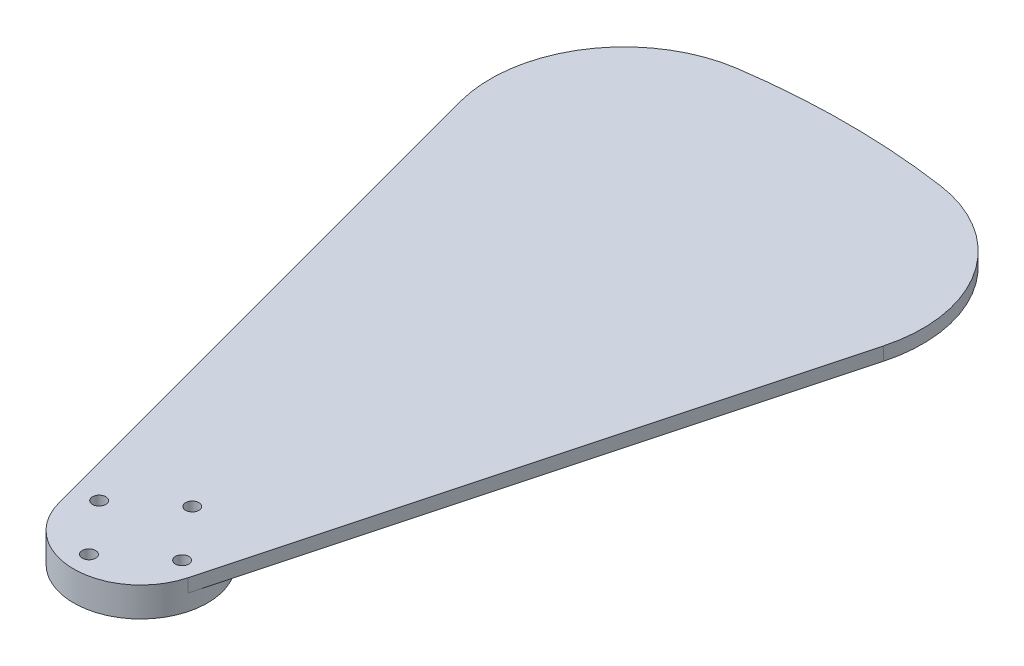
ISO-10303-21;
HEADER;
FILE_DESCRIPTION(('STEP AP214'),'2;1');
FILE_NAME('part.step','',(''),(''),'','','');
FILE_SCHEMA(('AUTOMOTIVE_DESIGN { 1 0 10303 214 1 1 1 1 }'));
ENDSEC;
DATA;
#1=APPLICATION_CONTEXT('core data for automotive mechanical design processes');
#2=APPLICATION_PROTOCOL_DEFINITION('international standard','automotive_design',2000,#1);
#3=PRODUCT_CONTEXT('',#1,'mechanical');
#4=PRODUCT('Part','Part','',(#3));
#5=PRODUCT_RELATED_PRODUCT_CATEGORY('part','',(#4));
#6=PRODUCT_DEFINITION_FORMATION('','',#4);
#7=PRODUCT_DEFINITION_CONTEXT('part definition',#1,'design');
#8=PRODUCT_DEFINITION('design','',#6,#7);
#9=PRODUCT_DEFINITION_SHAPE('','',#8);
#10=(LENGTH_UNIT() NAMED_UNIT(*) SI_UNIT(.MILLI.,.METRE.));
#11=(NAMED_UNIT(*) PLANE_ANGLE_UNIT() SI_UNIT($,.RADIAN.));
#12=(NAMED_UNIT(*) SI_UNIT($,.STERADIAN.) SOLID_ANGLE_UNIT());
#13=UNCERTAINTY_MEASURE_WITH_UNIT(LENGTH_MEASURE(1.E-05),#10,'distance_accuracy_value','');
#14=(GEOMETRIC_REPRESENTATION_CONTEXT(3) GLOBAL_UNCERTAINTY_ASSIGNED_CONTEXT((#13)) GLOBAL_UNIT_ASSIGNED_CONTEXT((#10,
#11,#12)) REPRESENTATION_CONTEXT('',''));
#15=CARTESIAN_POINT('',(0.,0.,0.));
#16=DIRECTION('',(0.,0.,1.));
#17=DIRECTION('',(1.,0.,0.));
#18=AXIS2_PLACEMENT_3D('',#15,#16,#17);
#19=CARTESIAN_POINT('',(0.,4.4,0.));
#20=DIRECTION('',(0.,-1.,0.));
#21=DIRECTION('',(0.,0.,-1.));
#22=AXIS2_PLACEMENT_3D('',#19,#20,#21);
#23=CYLINDRICAL_SURFACE('',#22,105.475115548645);
#24=CARTESIAN_POINT('',(0.,4.4,0.));
#25=DIRECTION('',(0.,-1.,0.));
#26=DIRECTION('',(0.,0.,-1.));
#27=AXIS2_PLACEMENT_3D('',#24,#25,#26);
#28=CIRCLE('',#27,105.475115548645);
#29=CARTESIAN_POINT('',(-15.1921075024969,4.4,-104.375283806237));
#30=VERTEX_POINT('',#29);
#31=CARTESIAN_POINT('',(15.1921075024969,4.4,-104.375283806237));
#32=VERTEX_POINT('',#31);
#33=EDGE_CURVE('E129',#30,#32,#28,.T.);
#34=ORIENTED_EDGE('',*,*,#33,.T.);
#35=DIRECTION('',(0.,-1.,0.));
#36=VECTOR('',#35,1.);
#37=CARTESIAN_POINT('',(15.1921075024969,4.4,-104.375283806237));
#38=LINE('',#37,#36);
#39=CARTESIAN_POINT('',(15.1921075024969,2.4,-104.375283806237));
#40=VERTEX_POINT('',#39);
#41=EDGE_CURVE('E122',#32,#40,#38,.T.);
#42=ORIENTED_EDGE('',*,*,#41,.T.);
#43=CARTESIAN_POINT('',(0.,2.4,0.));
#44=DIRECTION('',(0.,-1.,0.));
#45=DIRECTION('',(0.,0.,-1.));
#46=AXIS2_PLACEMENT_3D('',#43,#44,#45);
#47=CIRCLE('',#46,105.475115548645);
#48=CARTESIAN_POINT('',(-15.1921075024969,2.4,-104.375283806237));
#49=VERTEX_POINT('',#48);
#50=EDGE_CURVE('E105',#49,#40,#47,.T.);
#51=ORIENTED_EDGE('',*,*,#50,.F.);
#52=DIRECTION('',(0.,-1.,0.));
#53=VECTOR('',#52,1.);
#54=CARTESIAN_POINT('',(-15.1921075024969,4.4,-104.375283806237));
#55=LINE('',#54,#53);
#56=EDGE_CURVE('E120',#49,#30,#55,.F.);
#57=ORIENTED_EDGE('',*,*,#56,.T.);
#58=EDGE_LOOP('',(#34,#42,#51,#57));
#59=FACE_BOUND('',#58,.T.);
#60=ADVANCED_FACE('F41',(#59),#23,.T.);
#61=CARTESIAN_POINT('',(-9.65925826289068,4.4,2.58819045102521));
#62=DIRECTION('',(-0.965925826289068,0.,0.258819045102522));
#63=DIRECTION('',(0.258819045102522,0.,0.965925826289068));
#64=AXIS2_PLACEMENT_3D('',#61,#62,#63);
#65=PLANE('',#64);
#66=DIRECTION('',(-0.258819045102522,0.,-0.965925826289068));
#67=VECTOR('',#66,1.);
#68=CARTESIAN_POINT('',(-9.65925826289068,4.4,2.58819045102521));
#69=LINE('',#68,#67);
#70=CARTESIAN_POINT('',(-9.65925826289068,4.4,2.58819045102521));
#71=VERTEX_POINT('',#70);
#72=CARTESIAN_POINT('',(-31.6299241734408,4.4,-79.4074510032692));
#73=VERTEX_POINT('',#72);
#74=EDGE_CURVE('E115',#71,#73,#69,.T.);
#75=ORIENTED_EDGE('',*,*,#74,.T.);
#76=DIRECTION('',(0.,-1.,0.));
#77=VECTOR('',#76,1.);
#78=CARTESIAN_POINT('',(-31.6299241734408,4.4,-79.4074510032692));
#79=LINE('',#78,#77);
#80=CARTESIAN_POINT('',(-31.6299241734408,2.4,-79.4074510032692));
#81=VERTEX_POINT('',#80);
#82=EDGE_CURVE('E11',#73,#81,#79,.T.);
#83=ORIENTED_EDGE('',*,*,#82,.T.);
#84=DIRECTION('',(-0.258819045102522,0.,-0.965925826289068));
#85=VECTOR('',#84,1.);
#86=CARTESIAN_POINT('',(-9.65925826289068,2.4,2.58819045102521));
#87=LINE('',#86,#85);
#88=CARTESIAN_POINT('',(-9.65925826289068,2.4,2.58819045102521));
#89=VERTEX_POINT('',#88);
#90=EDGE_CURVE('E104',#89,#81,#87,.T.);
#91=ORIENTED_EDGE('',*,*,#90,.F.);
#92=DIRECTION('',(0.,-1.,0.));
#93=VECTOR('',#92,1.);
#94=CARTESIAN_POINT('',(-9.65925826289068,4.4,2.58819045102521));
#95=LINE('',#94,#93);
#96=EDGE_CURVE('E114',#71,#89,#95,.T.);
#97=ORIENTED_EDGE('',*,*,#96,.F.);
#98=EDGE_LOOP('',(#75,#83,#91,#97));
#99=FACE_BOUND('',#98,.T.);
#100=ADVANCED_FACE('F165',(#99),#65,.T.);
#101=CARTESIAN_POINT('',(0.,4.4,0.));
#102=DIRECTION('',(0.,-1.,0.));
#103=DIRECTION('',(0.,0.,-1.));
#104=AXIS2_PLACEMENT_3D('',#101,#102,#103);
#105=CYLINDRICAL_SURFACE('',#104,10.);
#106=ORIENTED_EDGE('',*,*,#96,.T.);
#107=CARTESIAN_POINT('',(0.,2.4,0.));
#108=DIRECTION('',(0.,-1.,0.));
#109=DIRECTION('',(0.,0.,-1.));
#110=AXIS2_PLACEMENT_3D('',#107,#108,#109);
#111=CIRCLE('',#110,10.);
#112=CARTESIAN_POINT('',(9.65925826289068,2.4,2.58819045102522));
#113=VERTEX_POINT('',#112);
#114=EDGE_CURVE('E101',#89,#113,#111,.T.);
#115=ORIENTED_EDGE('',*,*,#114,.T.);
#116=DIRECTION('',(0.,-1.,0.));
#117=VECTOR('',#116,1.);
#118=CARTESIAN_POINT('',(9.65925826289068,4.4,2.58819045102521));
#119=LINE('',#118,#117);
#120=CARTESIAN_POINT('',(9.65925826289068,4.4,2.58819045102521));
#121=VERTEX_POINT('',#120);
#122=EDGE_CURVE('E108',#121,#113,#119,.T.);
#123=ORIENTED_EDGE('',*,*,#122,.F.);
#124=CARTESIAN_POINT('',(0.,4.4,0.));
#125=DIRECTION('',(0.,-1.,0.));
#126=DIRECTION('',(0.,0.,-1.));
#127=AXIS2_PLACEMENT_3D('',#124,#125,#126);
#128=CIRCLE('',#127,10.);
#129=EDGE_CURVE('E133',#121,#71,#128,.T.);
#130=ORIENTED_EDGE('',*,*,#129,.T.);
#131=EDGE_LOOP('',(#106,#115,#123,#130));
#132=FACE_BOUND('',#131,.T.);
#133=CARTESIAN_POINT('',(0.,0.,0.));
#134=DIRECTION('',(0.,-1.,0.));
#135=DIRECTION('',(0.,0.,-1.));
#136=AXIS2_PLACEMENT_3D('',#133,#134,#135);
#137=CIRCLE('',#136,10.);
#138=CARTESIAN_POINT('',(0.,0.,-10.));
#139=VERTEX_POINT('',#138);
#140=EDGE_CURVE('E127',#139,#139,#137,.T.);
#141=ORIENTED_EDGE('',*,*,#140,.F.);
#142=EDGE_LOOP('',(#141));
#143=FACE_BOUND('',#142,.T.);
#144=ADVANCED_FACE('F117',(#132,#143),#105,.T.);
#145=CARTESIAN_POINT('',(36.8352579986555,4.4,-98.834021309327));
#146=DIRECTION('',(0.965925826289068,0.,0.258819045102522));
#147=DIRECTION('',(0.258819045102522,0.,-0.965925826289068));
#148=AXIS2_PLACEMENT_3D('',#145,#146,#147);
#149=PLANE('',#148);
#150=DIRECTION('',(-0.258819045102522,0.,0.965925826289068));
#151=VECTOR('',#150,1.);
#152=CARTESIAN_POINT('',(36.8352579986555,2.4,-98.834021309327));
#153=LINE('',#152,#151);
#154=CARTESIAN_POINT('',(31.6299241734408,2.4,-79.4074510032692));
#155=VERTEX_POINT('',#154);
#156=EDGE_CURVE('E95',#155,#113,#153,.T.);
#157=ORIENTED_EDGE('',*,*,#156,.F.);
#158=DIRECTION('',(0.,-1.,0.));
#159=VECTOR('',#158,1.);
#160=CARTESIAN_POINT('',(31.6299241734408,4.4,-79.4074510032692));
#161=LINE('',#160,#159);
#162=CARTESIAN_POINT('',(31.6299241734408,4.4,-79.4074510032692));
#163=VERTEX_POINT('',#162);
#164=EDGE_CURVE('E64',#155,#163,#161,.F.);
#165=ORIENTED_EDGE('',*,*,#164,.T.);
#166=DIRECTION('',(-0.258819045102522,0.,0.965925826289068));
#167=VECTOR('',#166,1.);
#168=CARTESIAN_POINT('',(36.8352579986555,4.4,-98.834021309327));
#169=LINE('',#168,#167);
#170=EDGE_CURVE('E110',#163,#121,#169,.T.);
#171=ORIENTED_EDGE('',*,*,#170,.T.);
#172=ORIENTED_EDGE('',*,*,#122,.T.);
#173=EDGE_LOOP('',(#157,#165,#171,#172));
#174=FACE_BOUND('',#173,.T.);
#175=ADVANCED_FACE('F109',(#174),#149,.T.);
#176=CARTESIAN_POINT('',(0.,4.4,0.));
#177=DIRECTION('',(0.,-1.,0.));
#178=DIRECTION('',(0.,0.,-1.));
#179=AXIS2_PLACEMENT_3D('',#176,#177,#178);
#180=PLANE('',#179);
#181=CARTESIAN_POINT('',(6.95839114253551,4.4,0.762097570904965));
#182=DIRECTION('',(0.,-1.,0.));
#183=DIRECTION('',(0.,0.,-1.));
#184=AXIS2_PLACEMENT_3D('',#181,#182,#183);
#185=CIRCLE('',#184,0.999999999998296);
#186=CARTESIAN_POINT('',(6.95839114253551,4.4,-0.237902429093332));
#187=VERTEX_POINT('',#186);
#188=EDGE_CURVE('E204',#187,#187,#185,.T.);
#189=ORIENTED_EDGE('',*,*,#188,.T.);
#190=EDGE_LOOP('',(#189));
#191=FACE_BOUND('',#190,.T.);
#192=CARTESIAN_POINT('',(0.762097570911941,4.4,-6.95839114252869));
#193=DIRECTION('',(0.,-1.,0.));
#194=DIRECTION('',(0.,0.,-1.));
#195=AXIS2_PLACEMENT_3D('',#192,#193,#194);
#196=CIRCLE('',#195,0.999999999998297);
#197=CARTESIAN_POINT('',(0.762097570911941,4.4,-7.95839114252699));
#198=VERTEX_POINT('',#197);
#199=EDGE_CURVE('E199',#198,#198,#196,.T.);
#200=ORIENTED_EDGE('',*,*,#199,.T.);
#201=EDGE_LOOP('',(#200));
#202=FACE_BOUND('',#201,.T.);
#203=CARTESIAN_POINT('',(-0.762097570898134,4.4,6.95839114252854));
#204=DIRECTION('',(0.,-1.,0.));
#205=DIRECTION('',(0.,0.,-1.));
#206=AXIS2_PLACEMENT_3D('',#203,#204,#205);
#207=CIRCLE('',#206,0.999999999998297);
#208=CARTESIAN_POINT('',(-0.762097570898134,4.4,5.95839114253024));
#209=VERTEX_POINT('',#208);
#210=EDGE_CURVE('E215',#209,#209,#207,.T.);
#211=ORIENTED_EDGE('',*,*,#210,.T.);
#212=EDGE_LOOP('',(#211));
#213=FACE_BOUND('',#212,.T.);
#214=CARTESIAN_POINT('',(-6.95839114252171,4.4,-0.762097570905104));
#215=DIRECTION('',(0.,-1.,0.));
#216=DIRECTION('',(0.,0.,-1.));
#217=AXIS2_PLACEMENT_3D('',#214,#215,#216);
#218=CIRCLE('',#217,0.999999999998296);
#219=CARTESIAN_POINT('',(-6.95839114252171,4.4,-1.7620975709034));
#220=VERTEX_POINT('',#219);
#221=EDGE_CURVE('E220',#220,#220,#218,.T.);
#222=ORIENTED_EDGE('',*,*,#221,.T.);
#223=EDGE_LOOP('',(#222));
#224=FACE_BOUND('',#223,.T.);
#225=ORIENTED_EDGE('',*,*,#170,.F.);
#226=CARTESIAN_POINT('',(12.3114076476595,4.4,-84.5838319053196));
#227=DIRECTION('',(0.,-1.,0.));
#228=DIRECTION('',(0.,0.,-1.));
#229=AXIS2_PLACEMENT_3D('',#226,#227,#228);
#230=CIRCLE('',#229,20.);
#231=EDGE_CURVE('E49',#163,#32,#230,.F.);
#232=ORIENTED_EDGE('',*,*,#231,.T.);
#233=ORIENTED_EDGE('',*,*,#33,.F.);
#234=CARTESIAN_POINT('',(-12.3114076476595,4.4,-84.5838319053196));
#235=DIRECTION('',(0.,-1.,0.));
#236=DIRECTION('',(0.,0.,-1.));
#237=AXIS2_PLACEMENT_3D('',#234,#235,#236);
#238=CIRCLE('',#237,20.);
#239=EDGE_CURVE('E56',#30,#73,#238,.F.);
#240=ORIENTED_EDGE('',*,*,#239,.T.);
#241=ORIENTED_EDGE('',*,*,#74,.F.);
#242=ORIENTED_EDGE('',*,*,#129,.F.);
#243=EDGE_LOOP('',(#225,#232,#233,#240,#241,#242));
#244=FACE_BOUND('',#243,.T.);
#245=ADVANCED_FACE('F145',(#191,#202,#213,#224,#244),#180,.F.);
#246=CARTESIAN_POINT('',(0.,2.4,0.));
#247=DIRECTION('',(0.,-1.,0.));
#248=DIRECTION('',(0.,0.,-1.));
#249=AXIS2_PLACEMENT_3D('',#246,#247,#248);
#250=PLANE('',#249);
#251=ORIENTED_EDGE('',*,*,#50,.T.);
#252=CARTESIAN_POINT('',(12.3114076476595,2.4,-84.5838319053196));
#253=DIRECTION('',(0.,-1.,0.));
#254=DIRECTION('',(0.,0.,-1.));
#255=AXIS2_PLACEMENT_3D('',#252,#253,#254);
#256=CIRCLE('',#255,20.);
#257=EDGE_CURVE('E103',#40,#155,#256,.T.);
#258=ORIENTED_EDGE('',*,*,#257,.T.);
#259=ORIENTED_EDGE('',*,*,#156,.T.);
#260=ORIENTED_EDGE('',*,*,#114,.F.);
#261=ORIENTED_EDGE('',*,*,#90,.T.);
#262=CARTESIAN_POINT('',(-12.3114076476595,2.4,-84.5838319053196));
#263=DIRECTION('',(0.,-1.,0.));
#264=DIRECTION('',(0.,0.,-1.));
#265=AXIS2_PLACEMENT_3D('',#262,#263,#264);
#266=CIRCLE('',#265,20.);
#267=EDGE_CURVE('E140',#81,#49,#266,.T.);
#268=ORIENTED_EDGE('',*,*,#267,.T.);
#269=EDGE_LOOP('',(#251,#258,#259,#260,#261,#268));
#270=FACE_BOUND('',#269,.T.);
#271=ADVANCED_FACE('F98',(#270),#250,.T.);
#272=CARTESIAN_POINT('',(0.,0.,0.));
#273=DIRECTION('',(0.,-1.,0.));
#274=DIRECTION('',(0.,0.,-1.));
#275=AXIS2_PLACEMENT_3D('',#272,#273,#274);
#276=PLANE('',#275);
#277=CARTESIAN_POINT('',(6.95839114253551,0.,0.762097570904965));
#278=DIRECTION('',(0.,-1.,0.));
#279=DIRECTION('',(0.,0.,-1.));
#280=AXIS2_PLACEMENT_3D('',#277,#278,#279);
#281=CIRCLE('',#280,0.999999999998296);
#282=CARTESIAN_POINT('',(6.95839114253551,0.,-0.237902429093332));
#283=VERTEX_POINT('',#282);
#284=EDGE_CURVE('E209',#283,#283,#281,.T.);
#285=ORIENTED_EDGE('',*,*,#284,.F.);
#286=EDGE_LOOP('',(#285));
#287=FACE_BOUND('',#286,.T.);
#288=CARTESIAN_POINT('',(0.762097570911941,0.,-6.95839114252869));
#289=DIRECTION('',(0.,-1.,0.));
#290=DIRECTION('',(0.,0.,-1.));
#291=AXIS2_PLACEMENT_3D('',#288,#289,#290);
#292=CIRCLE('',#291,0.999999999998297);
#293=CARTESIAN_POINT('',(0.762097570911941,0.,-7.95839114252699));
#294=VERTEX_POINT('',#293);
#295=EDGE_CURVE('E202',#294,#294,#292,.T.);
#296=ORIENTED_EDGE('',*,*,#295,.F.);
#297=EDGE_LOOP('',(#296));
#298=FACE_BOUND('',#297,.T.);
#299=CARTESIAN_POINT('',(-0.762097570898134,0.,6.95839114252854));
#300=DIRECTION('',(0.,-1.,0.));
#301=DIRECTION('',(0.,0.,-1.));
#302=AXIS2_PLACEMENT_3D('',#299,#300,#301);
#303=CIRCLE('',#302,0.999999999998297);
#304=CARTESIAN_POINT('',(-0.762097570898134,0.,5.95839114253024));
#305=VERTEX_POINT('',#304);
#306=EDGE_CURVE('E206',#305,#305,#303,.T.);
#307=ORIENTED_EDGE('',*,*,#306,.F.);
#308=EDGE_LOOP('',(#307));
#309=FACE_BOUND('',#308,.T.);
#310=CARTESIAN_POINT('',(-6.95839114252171,0.,-0.762097570905104));
#311=DIRECTION('',(0.,-1.,0.));
#312=DIRECTION('',(0.,0.,-1.));
#313=AXIS2_PLACEMENT_3D('',#310,#311,#312);
#314=CIRCLE('',#313,0.999999999998297);
#315=CARTESIAN_POINT('',(-6.95839114252171,0.,-1.7620975709034));
#316=VERTEX_POINT('',#315);
#317=EDGE_CURVE('E218',#316,#316,#314,.T.);
#318=ORIENTED_EDGE('',*,*,#317,.F.);
#319=EDGE_LOOP('',(#318));
#320=FACE_BOUND('',#319,.T.);
#321=ORIENTED_EDGE('',*,*,#140,.T.);
#322=EDGE_LOOP('',(#321));
#323=FACE_BOUND('',#322,.T.);
#324=ADVANCED_FACE('F177',(#287,#298,#309,#320,#323),#276,.T.);
#325=CARTESIAN_POINT('',(-6.95839114252171,0.,-0.762097570905104));
#326=DIRECTION('',(0.,-1.,0.));
#327=DIRECTION('',(0.,0.,-1.));
#328=AXIS2_PLACEMENT_3D('',#325,#326,#327);
#329=CYLINDRICAL_SURFACE('',#328,0.999999999998297);
#330=ORIENTED_EDGE('',*,*,#221,.F.);
#331=EDGE_LOOP('',(#330));
#332=FACE_BOUND('',#331,.T.);
#333=ORIENTED_EDGE('',*,*,#317,.T.);
#334=EDGE_LOOP('',(#333));
#335=FACE_BOUND('',#334,.T.);
#336=ADVANCED_FACE('F183',(#332,#335),#329,.F.);
#337=CARTESIAN_POINT('',(-0.762097570898134,0.,6.95839114252854));
#338=DIRECTION('',(0.,-1.,0.));
#339=DIRECTION('',(0.,0.,-1.));
#340=AXIS2_PLACEMENT_3D('',#337,#338,#339);
#341=CYLINDRICAL_SURFACE('',#340,0.999999999998297);
#342=ORIENTED_EDGE('',*,*,#210,.F.);
#343=EDGE_LOOP('',(#342));
#344=FACE_BOUND('',#343,.T.);
#345=ORIENTED_EDGE('',*,*,#306,.T.);
#346=EDGE_LOOP('',(#345));
#347=FACE_BOUND('',#346,.T.);
#348=ADVANCED_FACE('F187',(#344,#347),#341,.F.);
#349=CARTESIAN_POINT('',(0.762097570911941,0.,-6.95839114252869));
#350=DIRECTION('',(0.,-1.,0.));
#351=DIRECTION('',(0.,0.,-1.));
#352=AXIS2_PLACEMENT_3D('',#349,#350,#351);
#353=CYLINDRICAL_SURFACE('',#352,0.999999999998297);
#354=ORIENTED_EDGE('',*,*,#199,.F.);
#355=EDGE_LOOP('',(#354));
#356=FACE_BOUND('',#355,.T.);
#357=ORIENTED_EDGE('',*,*,#295,.T.);
#358=EDGE_LOOP('',(#357));
#359=FACE_BOUND('',#358,.T.);
#360=ADVANCED_FACE('F160',(#356,#359),#353,.F.);
#361=CARTESIAN_POINT('',(6.95839114253551,0.,0.762097570904965));
#362=DIRECTION('',(0.,-1.,0.));
#363=DIRECTION('',(0.,0.,-1.));
#364=AXIS2_PLACEMENT_3D('',#361,#362,#363);
#365=CYLINDRICAL_SURFACE('',#364,0.999999999998296);
#366=ORIENTED_EDGE('',*,*,#188,.F.);
#367=EDGE_LOOP('',(#366));
#368=FACE_BOUND('',#367,.T.);
#369=ORIENTED_EDGE('',*,*,#284,.T.);
#370=EDGE_LOOP('',(#369));
#371=FACE_BOUND('',#370,.T.);
#372=ADVANCED_FACE('F153',(#368,#371),#365,.F.);
#373=CARTESIAN_POINT('',(12.3114076476595,4.4,-84.5838319053196));
#374=DIRECTION('',(0.,-1.,0.));
#375=DIRECTION('',(0.,0.,-1.));
#376=AXIS2_PLACEMENT_3D('',#373,#374,#375);
#377=CYLINDRICAL_SURFACE('',#376,20.);
#378=ORIENTED_EDGE('',*,*,#231,.F.);
#379=ORIENTED_EDGE('',*,*,#164,.F.);
#380=ORIENTED_EDGE('',*,*,#257,.F.);
#381=ORIENTED_EDGE('',*,*,#41,.F.);
#382=EDGE_LOOP('',(#378,#379,#380,#381));
#383=FACE_BOUND('',#382,.T.);
#384=ADVANCED_FACE('F151',(#383),#377,.T.);
#385=CARTESIAN_POINT('',(-12.3114076476595,4.4,-84.5838319053196));
#386=DIRECTION('',(0.,-1.,0.));
#387=DIRECTION('',(0.,0.,-1.));
#388=AXIS2_PLACEMENT_3D('',#385,#386,#387);
#389=CYLINDRICAL_SURFACE('',#388,20.);
#390=ORIENTED_EDGE('',*,*,#239,.F.);
#391=ORIENTED_EDGE('',*,*,#56,.F.);
#392=ORIENTED_EDGE('',*,*,#267,.F.);
#393=ORIENTED_EDGE('',*,*,#82,.F.);
#394=EDGE_LOOP('',(#390,#391,#392,#393));
#395=FACE_BOUND('',#394,.T.);
#396=ADVANCED_FACE('F43',(#395),#389,.T.);
#397=CLOSED_SHELL('',(#60,#100,#144,#175,#245,#271,#324,#336,#348,#360,#372,#384,#396));
#398=MANIFOLD_SOLID_BREP('B2',#397);
#399=ADVANCED_BREP_SHAPE_REPRESENTATION('',(#18,#398),#14);
#400=SHAPE_DEFINITION_REPRESENTATION(#9,#399);
ENDSEC;
END-ISO-10303-21;
